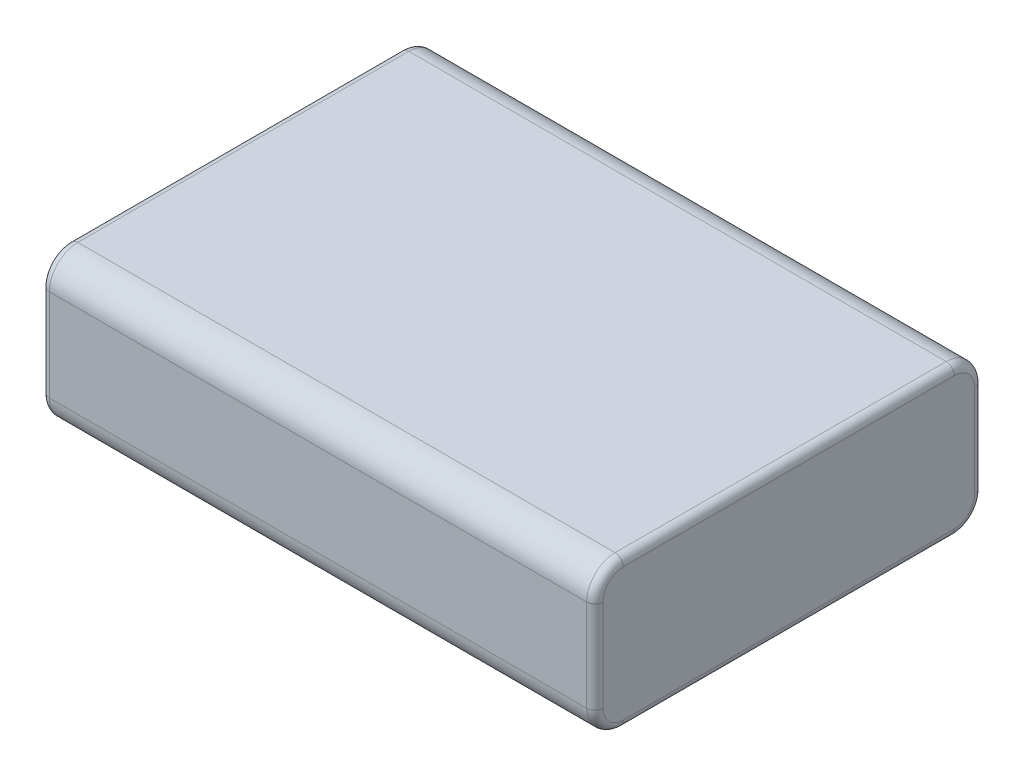
ISO-10303-21;
HEADER;
FILE_DESCRIPTION(('STEP AP214'),'2;1');
FILE_NAME('part.step','',(''),(''),'','','');
FILE_SCHEMA(('AUTOMOTIVE_DESIGN { 1 0 10303 214 1 1 1 1 }'));
ENDSEC;
DATA;
#1=APPLICATION_CONTEXT('core data for automotive mechanical design processes');
#2=APPLICATION_PROTOCOL_DEFINITION('international standard','automotive_design',2000,#1);
#3=PRODUCT_CONTEXT('',#1,'mechanical');
#4=PRODUCT('Part','Part','',(#3));
#5=PRODUCT_RELATED_PRODUCT_CATEGORY('part','',(#4));
#6=PRODUCT_DEFINITION_FORMATION('','',#4);
#7=PRODUCT_DEFINITION_CONTEXT('part definition',#1,'design');
#8=PRODUCT_DEFINITION('design','',#6,#7);
#9=PRODUCT_DEFINITION_SHAPE('','',#8);
#10=(LENGTH_UNIT() NAMED_UNIT(*) SI_UNIT(.MILLI.,.METRE.));
#11=(NAMED_UNIT(*) PLANE_ANGLE_UNIT() SI_UNIT($,.RADIAN.));
#12=(NAMED_UNIT(*) SI_UNIT($,.STERADIAN.) SOLID_ANGLE_UNIT());
#13=UNCERTAINTY_MEASURE_WITH_UNIT(LENGTH_MEASURE(1.E-05),#10,'distance_accuracy_value','');
#14=(GEOMETRIC_REPRESENTATION_CONTEXT(3) GLOBAL_UNCERTAINTY_ASSIGNED_CONTEXT((#13)) GLOBAL_UNIT_ASSIGNED_CONTEXT((#10,
#11,#12)) REPRESENTATION_CONTEXT('',''));
#15=CARTESIAN_POINT('',(0.,0.,0.));
#16=DIRECTION('',(0.,0.,1.));
#17=DIRECTION('',(1.,0.,0.));
#18=AXIS2_PLACEMENT_3D('',#15,#16,#17);
#19=CARTESIAN_POINT('',(34.,9.15,-23.825));
#20=DIRECTION('',(0.,0.,1.));
#21=DIRECTION('',(1.,0.,0.));
#22=AXIS2_PLACEMENT_3D('',#19,#20,#21);
#23=PLANE('',#22);
#24=DIRECTION('',(-1.,0.,0.));
#25=VECTOR('',#24,1.);
#26=CARTESIAN_POINT('',(34.,-5.65,-23.825));
#27=LINE('',#26,#25);
#28=CARTESIAN_POINT('',(33.,-5.65,-23.825));
#29=VERTEX_POINT('',#28);
#30=CARTESIAN_POINT('',(-33.,-5.65,-23.825));
#31=VERTEX_POINT('',#30);
#32=EDGE_CURVE('E302',#29,#31,#27,.T.);
#33=ORIENTED_EDGE('',*,*,#32,.T.);
#34=DIRECTION('',(0.,1.,0.));
#35=VECTOR('',#34,1.);
#36=CARTESIAN_POINT('',(-33.,9.15,-23.825));
#37=LINE('',#36,#35);
#38=CARTESIAN_POINT('',(-33.,5.65,-23.825));
#39=VERTEX_POINT('',#38);
#40=EDGE_CURVE('E201',#31,#39,#37,.T.);
#41=ORIENTED_EDGE('',*,*,#40,.T.);
#42=DIRECTION('',(-1.,0.,0.));
#43=VECTOR('',#42,1.);
#44=CARTESIAN_POINT('',(34.,5.65,-23.825));
#45=LINE('',#44,#43);
#46=CARTESIAN_POINT('',(33.,5.65,-23.825));
#47=VERTEX_POINT('',#46);
#48=EDGE_CURVE('E298',#39,#47,#45,.F.);
#49=ORIENTED_EDGE('',*,*,#48,.T.);
#50=DIRECTION('',(0.,1.,0.));
#51=VECTOR('',#50,1.);
#52=CARTESIAN_POINT('',(33.,-5.65,-23.825));
#53=LINE('',#52,#51);
#54=EDGE_CURVE('E199',#47,#29,#53,.F.);
#55=ORIENTED_EDGE('',*,*,#54,.T.);
#56=EDGE_LOOP('',(#33,#41,#49,#55));
#57=FACE_BOUND('',#56,.T.);
#58=ADVANCED_FACE('F36',(#57),#23,.F.);
#59=CARTESIAN_POINT('',(34.,9.15,23.825));
#60=DIRECTION('',(0.,-1.,0.));
#61=DIRECTION('',(0.,0.,-1.));
#62=AXIS2_PLACEMENT_3D('',#59,#60,#61);
#63=PLANE('',#62);
#64=DIRECTION('',(-1.,0.,0.));
#65=VECTOR('',#64,1.);
#66=CARTESIAN_POINT('',(34.,9.15,-20.325));
#67=LINE('',#66,#65);
#68=CARTESIAN_POINT('',(33.,9.15,-20.325));
#69=VERTEX_POINT('',#68);
#70=CARTESIAN_POINT('',(-33.,9.15,-20.325));
#71=VERTEX_POINT('',#70);
#72=EDGE_CURVE('E178',#69,#71,#67,.T.);
#73=ORIENTED_EDGE('',*,*,#72,.T.);
#74=DIRECTION('',(0.,0.,1.));
#75=VECTOR('',#74,1.);
#76=CARTESIAN_POINT('',(-33.,9.15,23.825));
#77=LINE('',#76,#75);
#78=CARTESIAN_POINT('',(-33.,9.15,20.325));
#79=VERTEX_POINT('',#78);
#80=EDGE_CURVE('E11',#71,#79,#77,.T.);
#81=ORIENTED_EDGE('',*,*,#80,.T.);
#82=DIRECTION('',(-1.,0.,0.));
#83=VECTOR('',#82,1.);
#84=CARTESIAN_POINT('',(34.,9.15,20.325));
#85=LINE('',#84,#83);
#86=CARTESIAN_POINT('',(33.,9.15,20.325));
#87=VERTEX_POINT('',#86);
#88=EDGE_CURVE('E175',#79,#87,#85,.F.);
#89=ORIENTED_EDGE('',*,*,#88,.T.);
#90=DIRECTION('',(0.,0.,1.));
#91=VECTOR('',#90,1.);
#92=CARTESIAN_POINT('',(33.,9.15,-20.325));
#93=LINE('',#92,#91);
#94=EDGE_CURVE('E45',#87,#69,#93,.F.);
#95=ORIENTED_EDGE('',*,*,#94,.T.);
#96=EDGE_LOOP('',(#73,#81,#89,#95));
#97=FACE_BOUND('',#96,.T.);
#98=ADVANCED_FACE('F311',(#97),#63,.F.);
#99=CARTESIAN_POINT('',(34.,9.15,23.825));
#100=DIRECTION('',(0.,0.,-1.));
#101=DIRECTION('',(0.,1.,0.));
#102=AXIS2_PLACEMENT_3D('',#99,#100,#101);
#103=PLANE('',#102);
#104=DIRECTION('',(-1.,0.,0.));
#105=VECTOR('',#104,1.);
#106=CARTESIAN_POINT('',(34.,5.65,23.825));
#107=LINE('',#106,#105);
#108=CARTESIAN_POINT('',(33.,5.65,23.825));
#109=VERTEX_POINT('',#108);
#110=CARTESIAN_POINT('',(-33.,5.65,23.825));
#111=VERTEX_POINT('',#110);
#112=EDGE_CURVE('E299',#109,#111,#107,.T.);
#113=ORIENTED_EDGE('',*,*,#112,.T.);
#114=DIRECTION('',(0.,-1.,0.));
#115=VECTOR('',#114,1.);
#116=CARTESIAN_POINT('',(-33.,9.15,23.825));
#117=LINE('',#116,#115);
#118=CARTESIAN_POINT('',(-33.,-5.65,23.825));
#119=VERTEX_POINT('',#118);
#120=EDGE_CURVE('E217',#111,#119,#117,.T.);
#121=ORIENTED_EDGE('',*,*,#120,.T.);
#122=DIRECTION('',(-1.,0.,0.));
#123=VECTOR('',#122,1.);
#124=CARTESIAN_POINT('',(34.,-5.65,23.825));
#125=LINE('',#124,#123);
#126=CARTESIAN_POINT('',(33.,-5.65,23.825));
#127=VERTEX_POINT('',#126);
#128=EDGE_CURVE('E289',#119,#127,#125,.F.);
#129=ORIENTED_EDGE('',*,*,#128,.T.);
#130=DIRECTION('',(0.,-1.,0.));
#131=VECTOR('',#130,1.);
#132=CARTESIAN_POINT('',(33.,5.65,23.825));
#133=LINE('',#132,#131);
#134=EDGE_CURVE('E215',#127,#109,#133,.F.);
#135=ORIENTED_EDGE('',*,*,#134,.T.);
#136=EDGE_LOOP('',(#113,#121,#129,#135));
#137=FACE_BOUND('',#136,.T.);
#138=ADVANCED_FACE('F295',(#137),#103,.F.);
#139=CARTESIAN_POINT('',(34.,-9.15,23.825));
#140=DIRECTION('',(0.,1.,0.));
#141=DIRECTION('',(0.,0.,1.));
#142=AXIS2_PLACEMENT_3D('',#139,#140,#141);
#143=PLANE('',#142);
#144=DIRECTION('',(-1.,0.,0.));
#145=VECTOR('',#144,1.);
#146=CARTESIAN_POINT('',(34.,-9.15,20.325));
#147=LINE('',#146,#145);
#148=CARTESIAN_POINT('',(33.,-9.15,20.325));
#149=VERTEX_POINT('',#148);
#150=CARTESIAN_POINT('',(-33.,-9.15,20.325));
#151=VERTEX_POINT('',#150);
#152=EDGE_CURVE('E292',#149,#151,#147,.T.);
#153=ORIENTED_EDGE('',*,*,#152,.T.);
#154=DIRECTION('',(0.,0.,-1.));
#155=VECTOR('',#154,1.);
#156=CARTESIAN_POINT('',(-33.,-9.15,23.825));
#157=LINE('',#156,#155);
#158=CARTESIAN_POINT('',(-33.,-9.15,-20.325));
#159=VERTEX_POINT('',#158);
#160=EDGE_CURVE('E209',#151,#159,#157,.T.);
#161=ORIENTED_EDGE('',*,*,#160,.T.);
#162=DIRECTION('',(-1.,0.,0.));
#163=VECTOR('',#162,1.);
#164=CARTESIAN_POINT('',(34.,-9.15,-20.325));
#165=LINE('',#164,#163);
#166=CARTESIAN_POINT('',(33.,-9.15,-20.325));
#167=VERTEX_POINT('',#166);
#168=EDGE_CURVE('E252',#159,#167,#165,.F.);
#169=ORIENTED_EDGE('',*,*,#168,.T.);
#170=DIRECTION('',(0.,0.,-1.));
#171=VECTOR('',#170,1.);
#172=CARTESIAN_POINT('',(33.,-9.15,20.325));
#173=LINE('',#172,#171);
#174=EDGE_CURVE('E207',#167,#149,#173,.F.);
#175=ORIENTED_EDGE('',*,*,#174,.T.);
#176=EDGE_LOOP('',(#153,#161,#169,#175));
#177=FACE_BOUND('',#176,.T.);
#178=ADVANCED_FACE('F331',(#177),#143,.F.);
#179=CARTESIAN_POINT('',(34.,0.,0.));
#180=DIRECTION('',(1.,0.,0.));
#181=DIRECTION('',(0.,0.,-1.));
#182=AXIS2_PLACEMENT_3D('',#179,#180,#181);
#183=PLANE('',#182);
#184=DIRECTION('',(0.,1.,0.));
#185=VECTOR('',#184,1.);
#186=CARTESIAN_POINT('',(34.,5.65,-22.825));
#187=LINE('',#186,#185);
#188=CARTESIAN_POINT('',(34.,-5.65,-22.825));
#189=VERTEX_POINT('',#188);
#190=CARTESIAN_POINT('',(34.,5.65,-22.825));
#191=VERTEX_POINT('',#190);
#192=EDGE_CURVE('E53',#189,#191,#187,.T.);
#193=ORIENTED_EDGE('',*,*,#192,.T.);
#194=CARTESIAN_POINT('',(34.,5.65,-20.325));
#195=DIRECTION('',(1.,0.,0.));
#196=DIRECTION('',(0.,0.,-1.));
#197=AXIS2_PLACEMENT_3D('',#194,#195,#196);
#198=CIRCLE('',#197,2.5);
#199=CARTESIAN_POINT('',(34.,8.15,-20.325));
#200=VERTEX_POINT('',#199);
#201=EDGE_CURVE('E234',#191,#200,#198,.T.);
#202=ORIENTED_EDGE('',*,*,#201,.T.);
#203=DIRECTION('',(0.,0.,1.));
#204=VECTOR('',#203,1.);
#205=CARTESIAN_POINT('',(34.,8.15,20.325));
#206=LINE('',#205,#204);
#207=CARTESIAN_POINT('',(34.,8.15,20.325));
#208=VERTEX_POINT('',#207);
#209=EDGE_CURVE('E222',#200,#208,#206,.T.);
#210=ORIENTED_EDGE('',*,*,#209,.T.);
#211=CARTESIAN_POINT('',(34.,5.65,20.325));
#212=DIRECTION('',(1.,0.,0.));
#213=DIRECTION('',(0.,0.,-1.));
#214=AXIS2_PLACEMENT_3D('',#211,#212,#213);
#215=CIRCLE('',#214,2.5);
#216=CARTESIAN_POINT('',(34.,5.65,22.825));
#217=VERTEX_POINT('',#216);
#218=EDGE_CURVE('E224',#208,#217,#215,.T.);
#219=ORIENTED_EDGE('',*,*,#218,.T.);
#220=DIRECTION('',(0.,-1.,0.));
#221=VECTOR('',#220,1.);
#222=CARTESIAN_POINT('',(34.,-5.65,22.825));
#223=LINE('',#222,#221);
#224=CARTESIAN_POINT('',(34.,-5.65,22.825));
#225=VERTEX_POINT('',#224);
#226=EDGE_CURVE('E226',#217,#225,#223,.T.);
#227=ORIENTED_EDGE('',*,*,#226,.T.);
#228=CARTESIAN_POINT('',(34.,-5.65,20.325));
#229=DIRECTION('',(1.,0.,0.));
#230=DIRECTION('',(0.,0.,-1.));
#231=AXIS2_PLACEMENT_3D('',#228,#229,#230);
#232=CIRCLE('',#231,2.5);
#233=CARTESIAN_POINT('',(34.,-8.15,20.325));
#234=VERTEX_POINT('',#233);
#235=EDGE_CURVE('E228',#225,#234,#232,.T.);
#236=ORIENTED_EDGE('',*,*,#235,.T.);
#237=DIRECTION('',(0.,0.,-1.));
#238=VECTOR('',#237,1.);
#239=CARTESIAN_POINT('',(34.,-8.15,-20.325));
#240=LINE('',#239,#238);
#241=CARTESIAN_POINT('',(34.,-8.15,-20.325));
#242=VERTEX_POINT('',#241);
#243=EDGE_CURVE('E230',#234,#242,#240,.T.);
#244=ORIENTED_EDGE('',*,*,#243,.T.);
#245=CARTESIAN_POINT('',(34.,-5.65,-20.325));
#246=DIRECTION('',(1.,0.,0.));
#247=DIRECTION('',(0.,0.,-1.));
#248=AXIS2_PLACEMENT_3D('',#245,#246,#247);
#249=CIRCLE('',#248,2.5);
#250=EDGE_CURVE('E58',#242,#189,#249,.T.);
#251=ORIENTED_EDGE('',*,*,#250,.T.);
#252=EDGE_LOOP('',(#193,#202,#210,#219,#227,#236,#244,#251));
#253=FACE_BOUND('',#252,.T.);
#254=ADVANCED_FACE('F329',(#253),#183,.T.);
#255=CARTESIAN_POINT('',(-34.,0.,0.));
#256=DIRECTION('',(1.,0.,0.));
#257=DIRECTION('',(0.,0.,-1.));
#258=AXIS2_PLACEMENT_3D('',#255,#256,#257);
#259=PLANE('',#258);
#260=DIRECTION('',(0.,0.,1.));
#261=VECTOR('',#260,1.);
#262=CARTESIAN_POINT('',(-34.,8.15,0.));
#263=LINE('',#262,#261);
#264=CARTESIAN_POINT('',(-34.,8.15,20.325));
#265=VERTEX_POINT('',#264);
#266=CARTESIAN_POINT('',(-34.,8.15,-20.325));
#267=VERTEX_POINT('',#266);
#268=EDGE_CURVE('E154',#265,#267,#263,.F.);
#269=ORIENTED_EDGE('',*,*,#268,.T.);
#270=CARTESIAN_POINT('',(-34.,5.65,-20.325));
#271=DIRECTION('',(1.,0.,0.));
#272=DIRECTION('',(0.,0.,-1.));
#273=AXIS2_PLACEMENT_3D('',#270,#271,#272);
#274=CIRCLE('',#273,2.5);
#275=CARTESIAN_POINT('',(-34.,5.65,-22.825));
#276=VERTEX_POINT('',#275);
#277=EDGE_CURVE('E191',#267,#276,#274,.F.);
#278=ORIENTED_EDGE('',*,*,#277,.T.);
#279=DIRECTION('',(0.,1.,0.));
#280=VECTOR('',#279,1.);
#281=CARTESIAN_POINT('',(-34.,0.,-22.825));
#282=LINE('',#281,#280);
#283=CARTESIAN_POINT('',(-34.,-5.65,-22.825));
#284=VERTEX_POINT('',#283);
#285=EDGE_CURVE('E189',#276,#284,#282,.F.);
#286=ORIENTED_EDGE('',*,*,#285,.T.);
#287=CARTESIAN_POINT('',(-34.,-5.65,-20.325));
#288=DIRECTION('',(1.,0.,0.));
#289=DIRECTION('',(0.,0.,-1.));
#290=AXIS2_PLACEMENT_3D('',#287,#288,#289);
#291=CIRCLE('',#290,2.5);
#292=CARTESIAN_POINT('',(-34.,-8.15,-20.325));
#293=VERTEX_POINT('',#292);
#294=EDGE_CURVE('E187',#284,#293,#291,.F.);
#295=ORIENTED_EDGE('',*,*,#294,.T.);
#296=DIRECTION('',(0.,0.,-1.));
#297=VECTOR('',#296,1.);
#298=CARTESIAN_POINT('',(-34.,-8.15,0.));
#299=LINE('',#298,#297);
#300=CARTESIAN_POINT('',(-34.,-8.15,20.325));
#301=VERTEX_POINT('',#300);
#302=EDGE_CURVE('E185',#293,#301,#299,.F.);
#303=ORIENTED_EDGE('',*,*,#302,.T.);
#304=CARTESIAN_POINT('',(-34.,-5.65,20.325));
#305=DIRECTION('',(1.,0.,0.));
#306=DIRECTION('',(0.,0.,-1.));
#307=AXIS2_PLACEMENT_3D('',#304,#305,#306);
#308=CIRCLE('',#307,2.5);
#309=CARTESIAN_POINT('',(-34.,-5.65,22.825));
#310=VERTEX_POINT('',#309);
#311=EDGE_CURVE('E183',#301,#310,#308,.F.);
#312=ORIENTED_EDGE('',*,*,#311,.T.);
#313=DIRECTION('',(0.,-1.,0.));
#314=VECTOR('',#313,1.);
#315=CARTESIAN_POINT('',(-34.,0.,22.825));
#316=LINE('',#315,#314);
#317=CARTESIAN_POINT('',(-34.,5.65,22.825));
#318=VERTEX_POINT('',#317);
#319=EDGE_CURVE('E157',#310,#318,#316,.F.);
#320=ORIENTED_EDGE('',*,*,#319,.T.);
#321=CARTESIAN_POINT('',(-34.,5.65,20.325));
#322=DIRECTION('',(1.,0.,0.));
#323=DIRECTION('',(0.,0.,-1.));
#324=AXIS2_PLACEMENT_3D('',#321,#322,#323);
#325=CIRCLE('',#324,2.5);
#326=EDGE_CURVE('E149',#318,#265,#325,.F.);
#327=ORIENTED_EDGE('',*,*,#326,.T.);
#328=EDGE_LOOP('',(#269,#278,#286,#295,#303,#312,#320,#327));
#329=FACE_BOUND('',#328,.T.);
#330=ADVANCED_FACE('F151',(#329),#259,.F.);
#331=CARTESIAN_POINT('',(34.,-5.65,20.325));
#332=DIRECTION('',(-1.,0.,0.));
#333=DIRECTION('',(0.,0.,1.));
#334=AXIS2_PLACEMENT_3D('',#331,#332,#333);
#335=CYLINDRICAL_SURFACE('',#334,3.5);
#336=ORIENTED_EDGE('',*,*,#128,.F.);
#337=CARTESIAN_POINT('',(-33.,-5.65,20.325));
#338=DIRECTION('',(1.,0.,0.));
#339=DIRECTION('',(0.,0.,-1.));
#340=AXIS2_PLACEMENT_3D('',#337,#338,#339);
#341=CIRCLE('',#340,3.5);
#342=EDGE_CURVE('E213',#119,#151,#341,.T.);
#343=ORIENTED_EDGE('',*,*,#342,.T.);
#344=ORIENTED_EDGE('',*,*,#152,.F.);
#345=CARTESIAN_POINT('',(33.,-5.65,20.325));
#346=DIRECTION('',(1.,0.,0.));
#347=DIRECTION('',(0.,0.,-1.));
#348=AXIS2_PLACEMENT_3D('',#345,#346,#347);
#349=CIRCLE('',#348,3.5);
#350=EDGE_CURVE('E211',#149,#127,#349,.F.);
#351=ORIENTED_EDGE('',*,*,#350,.T.);
#352=EDGE_LOOP('',(#336,#343,#344,#351));
#353=FACE_BOUND('',#352,.T.);
#354=ADVANCED_FACE('F288',(#353),#335,.T.);
#355=CARTESIAN_POINT('',(34.,-5.65,-20.325));
#356=DIRECTION('',(-1.,0.,0.));
#357=DIRECTION('',(0.,0.,1.));
#358=AXIS2_PLACEMENT_3D('',#355,#356,#357);
#359=CYLINDRICAL_SURFACE('',#358,3.5);
#360=ORIENTED_EDGE('',*,*,#168,.F.);
#361=CARTESIAN_POINT('',(-33.,-5.65,-20.325));
#362=DIRECTION('',(1.,0.,0.));
#363=DIRECTION('',(0.,0.,-1.));
#364=AXIS2_PLACEMENT_3D('',#361,#362,#363);
#365=CIRCLE('',#364,3.5);
#366=EDGE_CURVE('E205',#159,#31,#365,.T.);
#367=ORIENTED_EDGE('',*,*,#366,.T.);
#368=ORIENTED_EDGE('',*,*,#32,.F.);
#369=CARTESIAN_POINT('',(33.,-5.65,-20.325));
#370=DIRECTION('',(1.,0.,0.));
#371=DIRECTION('',(0.,0.,-1.));
#372=AXIS2_PLACEMENT_3D('',#369,#370,#371);
#373=CIRCLE('',#372,3.5);
#374=EDGE_CURVE('E203',#29,#167,#373,.F.);
#375=ORIENTED_EDGE('',*,*,#374,.T.);
#376=EDGE_LOOP('',(#360,#367,#368,#375));
#377=FACE_BOUND('',#376,.T.);
#378=ADVANCED_FACE('F351',(#377),#359,.T.);
#379=CARTESIAN_POINT('',(34.,5.65,20.325));
#380=DIRECTION('',(-1.,0.,0.));
#381=DIRECTION('',(0.,0.,1.));
#382=AXIS2_PLACEMENT_3D('',#379,#380,#381);
#383=CYLINDRICAL_SURFACE('',#382,3.5);
#384=ORIENTED_EDGE('',*,*,#88,.F.);
#385=CARTESIAN_POINT('',(-33.,5.65,20.325));
#386=DIRECTION('',(1.,0.,0.));
#387=DIRECTION('',(0.,0.,-1.));
#388=AXIS2_PLACEMENT_3D('',#385,#386,#387);
#389=CIRCLE('',#388,3.5);
#390=EDGE_CURVE('E166',#79,#111,#389,.T.);
#391=ORIENTED_EDGE('',*,*,#390,.T.);
#392=ORIENTED_EDGE('',*,*,#112,.F.);
#393=CARTESIAN_POINT('',(33.,5.65,20.325));
#394=DIRECTION('',(1.,0.,0.));
#395=DIRECTION('',(0.,0.,-1.));
#396=AXIS2_PLACEMENT_3D('',#393,#394,#395);
#397=CIRCLE('',#396,3.5);
#398=EDGE_CURVE('E219',#109,#87,#397,.F.);
#399=ORIENTED_EDGE('',*,*,#398,.T.);
#400=EDGE_LOOP('',(#384,#391,#392,#399));
#401=FACE_BOUND('',#400,.T.);
#402=ADVANCED_FACE('F354',(#401),#383,.T.);
#403=CARTESIAN_POINT('',(34.,5.65,-20.325));
#404=DIRECTION('',(-1.,0.,0.));
#405=DIRECTION('',(0.,0.,1.));
#406=AXIS2_PLACEMENT_3D('',#403,#404,#405);
#407=CYLINDRICAL_SURFACE('',#406,3.5);
#408=ORIENTED_EDGE('',*,*,#48,.F.);
#409=CARTESIAN_POINT('',(-33.,5.65,-20.325));
#410=DIRECTION('',(1.,0.,0.));
#411=DIRECTION('',(0.,0.,-1.));
#412=AXIS2_PLACEMENT_3D('',#409,#410,#411);
#413=CIRCLE('',#412,3.5);
#414=EDGE_CURVE('E196',#39,#71,#413,.T.);
#415=ORIENTED_EDGE('',*,*,#414,.T.);
#416=ORIENTED_EDGE('',*,*,#72,.F.);
#417=CARTESIAN_POINT('',(33.,5.65,-20.325));
#418=DIRECTION('',(1.,0.,0.));
#419=DIRECTION('',(0.,0.,-1.));
#420=AXIS2_PLACEMENT_3D('',#417,#418,#419);
#421=CIRCLE('',#420,3.5);
#422=EDGE_CURVE('E193',#69,#47,#421,.F.);
#423=ORIENTED_EDGE('',*,*,#422,.T.);
#424=EDGE_LOOP('',(#408,#415,#416,#423));
#425=FACE_BOUND('',#424,.T.);
#426=ADVANCED_FACE('F317',(#425),#407,.T.);
#427=CARTESIAN_POINT('',(-33.,-5.65,20.325));
#428=DIRECTION('',(1.,0.,0.));
#429=DIRECTION('',(0.,0.,-1.));
#430=AXIS2_PLACEMENT_3D('',#427,#428,#429);
#431=TOROIDAL_SURFACE('',#430,2.5,1.);
#432=CARTESIAN_POINT('',(-33.,-8.15,20.325));
#433=DIRECTION('',(0.,0.,-1.));
#434=DIRECTION('',(-1.,0.,0.));
#435=AXIS2_PLACEMENT_3D('',#432,#433,#434);
#436=CIRCLE('',#435,1.);
#437=EDGE_CURVE('E246',#151,#301,#436,.T.);
#438=ORIENTED_EDGE('',*,*,#437,.F.);
#439=ORIENTED_EDGE('',*,*,#342,.F.);
#440=CARTESIAN_POINT('',(-33.,-5.65,22.825));
#441=DIRECTION('',(0.,1.,0.));
#442=DIRECTION('',(0.,0.,1.));
#443=AXIS2_PLACEMENT_3D('',#440,#441,#442);
#444=CIRCLE('',#443,1.);
#445=EDGE_CURVE('E249',#310,#119,#444,.T.);
#446=ORIENTED_EDGE('',*,*,#445,.F.);
#447=ORIENTED_EDGE('',*,*,#311,.F.);
#448=EDGE_LOOP('',(#438,#439,#446,#447));
#449=FACE_BOUND('',#448,.T.);
#450=ADVANCED_FACE('F361',(#449),#431,.T.);
#451=CARTESIAN_POINT('',(-33.,9.15,22.825));
#452=DIRECTION('',(0.,-1.,0.));
#453=DIRECTION('',(0.,0.,-1.));
#454=AXIS2_PLACEMENT_3D('',#451,#452,#453);
#455=CYLINDRICAL_SURFACE('',#454,1.);
#456=ORIENTED_EDGE('',*,*,#445,.T.);
#457=ORIENTED_EDGE('',*,*,#120,.F.);
#458=CARTESIAN_POINT('',(-33.,5.65,22.825));
#459=DIRECTION('',(0.,1.,0.));
#460=DIRECTION('',(0.,0.,1.));
#461=AXIS2_PLACEMENT_3D('',#458,#459,#460);
#462=CIRCLE('',#461,1.);
#463=EDGE_CURVE('E244',#318,#111,#462,.T.);
#464=ORIENTED_EDGE('',*,*,#463,.F.);
#465=ORIENTED_EDGE('',*,*,#319,.F.);
#466=EDGE_LOOP('',(#456,#457,#464,#465));
#467=FACE_BOUND('',#466,.T.);
#468=ADVANCED_FACE('F381',(#467),#455,.T.);
#469=CARTESIAN_POINT('',(-33.,-8.15,23.825));
#470=DIRECTION('',(0.,0.,-1.));
#471=DIRECTION('',(-1.,0.,0.));
#472=AXIS2_PLACEMENT_3D('',#469,#470,#471);
#473=CYLINDRICAL_SURFACE('',#472,1.);
#474=ORIENTED_EDGE('',*,*,#437,.T.);
#475=ORIENTED_EDGE('',*,*,#302,.F.);
#476=CARTESIAN_POINT('',(-33.,-8.15,-20.325));
#477=DIRECTION('',(0.,0.,-1.));
#478=DIRECTION('',(-1.,0.,0.));
#479=AXIS2_PLACEMENT_3D('',#476,#477,#478);
#480=CIRCLE('',#479,1.);
#481=EDGE_CURVE('E169',#159,#293,#480,.T.);
#482=ORIENTED_EDGE('',*,*,#481,.F.);
#483=ORIENTED_EDGE('',*,*,#160,.F.);
#484=EDGE_LOOP('',(#474,#475,#482,#483));
#485=FACE_BOUND('',#484,.T.);
#486=ADVANCED_FACE('F378',(#485),#473,.T.);
#487=CARTESIAN_POINT('',(-33.,5.65,20.325));
#488=DIRECTION('',(1.,0.,0.));
#489=DIRECTION('',(0.,0.,-1.));
#490=AXIS2_PLACEMENT_3D('',#487,#488,#489);
#491=TOROIDAL_SURFACE('',#490,2.5,1.);
#492=ORIENTED_EDGE('',*,*,#463,.T.);
#493=ORIENTED_EDGE('',*,*,#390,.F.);
#494=CARTESIAN_POINT('',(-33.,8.15,20.325));
#495=DIRECTION('',(0.,0.,-1.));
#496=DIRECTION('',(-1.,0.,0.));
#497=AXIS2_PLACEMENT_3D('',#494,#495,#496);
#498=CIRCLE('',#497,1.);
#499=EDGE_CURVE('E164',#265,#79,#498,.T.);
#500=ORIENTED_EDGE('',*,*,#499,.F.);
#501=ORIENTED_EDGE('',*,*,#326,.F.);
#502=EDGE_LOOP('',(#492,#493,#500,#501));
#503=FACE_BOUND('',#502,.T.);
#504=ADVANCED_FACE('F165',(#503),#491,.T.);
#505=CARTESIAN_POINT('',(-33.,-5.65,-20.325));
#506=DIRECTION('',(1.,0.,0.));
#507=DIRECTION('',(0.,0.,-1.));
#508=AXIS2_PLACEMENT_3D('',#505,#506,#507);
#509=TOROIDAL_SURFACE('',#508,2.5,1.);
#510=ORIENTED_EDGE('',*,*,#481,.T.);
#511=ORIENTED_EDGE('',*,*,#294,.F.);
#512=CARTESIAN_POINT('',(-33.,-5.65,-22.825));
#513=DIRECTION('',(0.,1.,0.));
#514=DIRECTION('',(0.,0.,1.));
#515=AXIS2_PLACEMENT_3D('',#512,#513,#514);
#516=CIRCLE('',#515,1.);
#517=EDGE_CURVE('E170',#31,#284,#516,.T.);
#518=ORIENTED_EDGE('',*,*,#517,.F.);
#519=ORIENTED_EDGE('',*,*,#366,.F.);
#520=EDGE_LOOP('',(#510,#511,#518,#519));
#521=FACE_BOUND('',#520,.T.);
#522=ADVANCED_FACE('F372',(#521),#509,.T.);
#523=CARTESIAN_POINT('',(-33.,8.15,23.825));
#524=DIRECTION('',(0.,0.,1.));
#525=DIRECTION('',(1.,0.,0.));
#526=AXIS2_PLACEMENT_3D('',#523,#524,#525);
#527=CYLINDRICAL_SURFACE('',#526,1.);
#528=ORIENTED_EDGE('',*,*,#499,.T.);
#529=ORIENTED_EDGE('',*,*,#80,.F.);
#530=CARTESIAN_POINT('',(-33.,8.15,-20.325));
#531=DIRECTION('',(0.,0.,-1.));
#532=DIRECTION('',(-1.,0.,0.));
#533=AXIS2_PLACEMENT_3D('',#530,#531,#532);
#534=CIRCLE('',#533,1.);
#535=EDGE_CURVE('E173',#267,#71,#534,.T.);
#536=ORIENTED_EDGE('',*,*,#535,.F.);
#537=ORIENTED_EDGE('',*,*,#268,.F.);
#538=EDGE_LOOP('',(#528,#529,#536,#537));
#539=FACE_BOUND('',#538,.T.);
#540=ADVANCED_FACE('F172',(#539),#527,.T.);
#541=CARTESIAN_POINT('',(-33.,9.15,-22.825));
#542=DIRECTION('',(0.,1.,0.));
#543=DIRECTION('',(0.,0.,1.));
#544=AXIS2_PLACEMENT_3D('',#541,#542,#543);
#545=CYLINDRICAL_SURFACE('',#544,1.);
#546=ORIENTED_EDGE('',*,*,#517,.T.);
#547=ORIENTED_EDGE('',*,*,#285,.F.);
#548=CARTESIAN_POINT('',(-33.,5.65,-22.825));
#549=DIRECTION('',(0.,1.,0.));
#550=DIRECTION('',(0.,0.,1.));
#551=AXIS2_PLACEMENT_3D('',#548,#549,#550);
#552=CIRCLE('',#551,1.);
#553=EDGE_CURVE('E237',#39,#276,#552,.T.);
#554=ORIENTED_EDGE('',*,*,#553,.F.);
#555=ORIENTED_EDGE('',*,*,#40,.F.);
#556=EDGE_LOOP('',(#546,#547,#554,#555));
#557=FACE_BOUND('',#556,.T.);
#558=ADVANCED_FACE('F365',(#557),#545,.T.);
#559=CARTESIAN_POINT('',(-33.,5.65,-20.325));
#560=DIRECTION('',(1.,0.,0.));
#561=DIRECTION('',(0.,0.,-1.));
#562=AXIS2_PLACEMENT_3D('',#559,#560,#561);
#563=TOROIDAL_SURFACE('',#562,2.5,1.);
#564=ORIENTED_EDGE('',*,*,#535,.T.);
#565=ORIENTED_EDGE('',*,*,#414,.F.);
#566=ORIENTED_EDGE('',*,*,#553,.T.);
#567=ORIENTED_EDGE('',*,*,#277,.F.);
#568=EDGE_LOOP('',(#564,#565,#566,#567));
#569=FACE_BOUND('',#568,.T.);
#570=ADVANCED_FACE('F362',(#569),#563,.T.);
#571=CARTESIAN_POINT('',(33.,-5.65,20.325));
#572=DIRECTION('',(1.,0.,0.));
#573=DIRECTION('',(0.,0.,-1.));
#574=AXIS2_PLACEMENT_3D('',#571,#572,#573);
#575=TOROIDAL_SURFACE('',#574,2.5,1.);
#576=CARTESIAN_POINT('',(33.,-5.65,22.825));
#577=DIRECTION('',(0.,1.,0.));
#578=DIRECTION('',(0.,0.,1.));
#579=AXIS2_PLACEMENT_3D('',#576,#577,#578);
#580=CIRCLE('',#579,1.);
#581=EDGE_CURVE('E268',#127,#225,#580,.T.);
#582=ORIENTED_EDGE('',*,*,#581,.F.);
#583=ORIENTED_EDGE('',*,*,#350,.F.);
#584=CARTESIAN_POINT('',(33.,-8.15,20.325));
#585=DIRECTION('',(0.,0.,-1.));
#586=DIRECTION('',(-1.,0.,0.));
#587=AXIS2_PLACEMENT_3D('',#584,#585,#586);
#588=CIRCLE('',#587,1.);
#589=EDGE_CURVE('E40',#234,#149,#588,.T.);
#590=ORIENTED_EDGE('',*,*,#589,.F.);
#591=ORIENTED_EDGE('',*,*,#235,.F.);
#592=EDGE_LOOP('',(#582,#583,#590,#591));
#593=FACE_BOUND('',#592,.T.);
#594=ADVANCED_FACE('F38',(#593),#575,.T.);
#595=CARTESIAN_POINT('',(33.,-8.15,0.));
#596=DIRECTION('',(0.,0.,1.));
#597=DIRECTION('',(1.,0.,0.));
#598=AXIS2_PLACEMENT_3D('',#595,#596,#597);
#599=CYLINDRICAL_SURFACE('',#598,1.);
#600=ORIENTED_EDGE('',*,*,#589,.T.);
#601=ORIENTED_EDGE('',*,*,#174,.F.);
#602=CARTESIAN_POINT('',(33.,-8.15,-20.325));
#603=DIRECTION('',(0.,0.,-1.));
#604=DIRECTION('',(-1.,0.,0.));
#605=AXIS2_PLACEMENT_3D('',#602,#603,#604);
#606=CIRCLE('',#605,1.);
#607=EDGE_CURVE('E266',#242,#167,#606,.T.);
#608=ORIENTED_EDGE('',*,*,#607,.F.);
#609=ORIENTED_EDGE('',*,*,#243,.F.);
#610=EDGE_LOOP('',(#600,#601,#608,#609));
#611=FACE_BOUND('',#610,.T.);
#612=ADVANCED_FACE('F279',(#611),#599,.T.);
#613=CARTESIAN_POINT('',(33.,0.,22.825));
#614=DIRECTION('',(0.,1.,0.));
#615=DIRECTION('',(0.,0.,1.));
#616=AXIS2_PLACEMENT_3D('',#613,#614,#615);
#617=CYLINDRICAL_SURFACE('',#616,1.);
#618=ORIENTED_EDGE('',*,*,#581,.T.);
#619=ORIENTED_EDGE('',*,*,#226,.F.);
#620=CARTESIAN_POINT('',(33.,5.65,22.825));
#621=DIRECTION('',(0.,1.,0.));
#622=DIRECTION('',(0.,0.,1.));
#623=AXIS2_PLACEMENT_3D('',#620,#621,#622);
#624=CIRCLE('',#623,1.);
#625=EDGE_CURVE('E263',#109,#217,#624,.T.);
#626=ORIENTED_EDGE('',*,*,#625,.F.);
#627=ORIENTED_EDGE('',*,*,#134,.F.);
#628=EDGE_LOOP('',(#618,#619,#626,#627));
#629=FACE_BOUND('',#628,.T.);
#630=ADVANCED_FACE('F404',(#629),#617,.T.);
#631=CARTESIAN_POINT('',(33.,-5.65,-20.325));
#632=DIRECTION('',(1.,0.,0.));
#633=DIRECTION('',(0.,0.,-1.));
#634=AXIS2_PLACEMENT_3D('',#631,#632,#633);
#635=TOROIDAL_SURFACE('',#634,2.5,1.);
#636=ORIENTED_EDGE('',*,*,#607,.T.);
#637=ORIENTED_EDGE('',*,*,#374,.F.);
#638=CARTESIAN_POINT('',(33.,-5.65,-22.825));
#639=DIRECTION('',(0.,1.,0.));
#640=DIRECTION('',(0.,0.,1.));
#641=AXIS2_PLACEMENT_3D('',#638,#639,#640);
#642=CIRCLE('',#641,1.);
#643=EDGE_CURVE('E260',#189,#29,#642,.T.);
#644=ORIENTED_EDGE('',*,*,#643,.F.);
#645=ORIENTED_EDGE('',*,*,#250,.F.);
#646=EDGE_LOOP('',(#636,#637,#644,#645));
#647=FACE_BOUND('',#646,.T.);
#648=ADVANCED_FACE('F400',(#647),#635,.T.);
#649=CARTESIAN_POINT('',(33.,5.65,20.325));
#650=DIRECTION('',(1.,0.,0.));
#651=DIRECTION('',(0.,0.,-1.));
#652=AXIS2_PLACEMENT_3D('',#649,#650,#651);
#653=TOROIDAL_SURFACE('',#652,2.5,1.);
#654=ORIENTED_EDGE('',*,*,#625,.T.);
#655=ORIENTED_EDGE('',*,*,#218,.F.);
#656=CARTESIAN_POINT('',(33.,8.15,20.325));
#657=DIRECTION('',(0.,0.,-1.));
#658=DIRECTION('',(-1.,0.,0.));
#659=AXIS2_PLACEMENT_3D('',#656,#657,#658);
#660=CIRCLE('',#659,1.);
#661=EDGE_CURVE('E257',#87,#208,#660,.T.);
#662=ORIENTED_EDGE('',*,*,#661,.F.);
#663=ORIENTED_EDGE('',*,*,#398,.F.);
#664=EDGE_LOOP('',(#654,#655,#662,#663));
#665=FACE_BOUND('',#664,.T.);
#666=ADVANCED_FACE('F396',(#665),#653,.T.);
#667=CARTESIAN_POINT('',(33.,0.,-22.825));
#668=DIRECTION('',(0.,-1.,0.));
#669=DIRECTION('',(0.,0.,-1.));
#670=AXIS2_PLACEMENT_3D('',#667,#668,#669);
#671=CYLINDRICAL_SURFACE('',#670,1.);
#672=ORIENTED_EDGE('',*,*,#643,.T.);
#673=ORIENTED_EDGE('',*,*,#54,.F.);
#674=CARTESIAN_POINT('',(33.,5.65,-22.825));
#675=DIRECTION('',(0.,1.,0.));
#676=DIRECTION('',(0.,0.,1.));
#677=AXIS2_PLACEMENT_3D('',#674,#675,#676);
#678=CIRCLE('',#677,1.);
#679=EDGE_CURVE('E255',#191,#47,#678,.T.);
#680=ORIENTED_EDGE('',*,*,#679,.F.);
#681=ORIENTED_EDGE('',*,*,#192,.F.);
#682=EDGE_LOOP('',(#672,#673,#680,#681));
#683=FACE_BOUND('',#682,.T.);
#684=ADVANCED_FACE('F393',(#683),#671,.T.);
#685=CARTESIAN_POINT('',(33.,8.15,0.));
#686=DIRECTION('',(0.,0.,-1.));
#687=DIRECTION('',(-1.,0.,0.));
#688=AXIS2_PLACEMENT_3D('',#685,#686,#687);
#689=CYLINDRICAL_SURFACE('',#688,1.);
#690=ORIENTED_EDGE('',*,*,#661,.T.);
#691=ORIENTED_EDGE('',*,*,#209,.F.);
#692=CARTESIAN_POINT('',(33.,8.15,-20.325));
#693=DIRECTION('',(0.,0.,-1.));
#694=DIRECTION('',(-1.,0.,0.));
#695=AXIS2_PLACEMENT_3D('',#692,#693,#694);
#696=CIRCLE('',#695,1.);
#697=EDGE_CURVE('E253',#69,#200,#696,.T.);
#698=ORIENTED_EDGE('',*,*,#697,.F.);
#699=ORIENTED_EDGE('',*,*,#94,.F.);
#700=EDGE_LOOP('',(#690,#691,#698,#699));
#701=FACE_BOUND('',#700,.T.);
#702=ADVANCED_FACE('F326',(#701),#689,.T.);
#703=CARTESIAN_POINT('',(33.,5.65,-20.325));
#704=DIRECTION('',(1.,0.,0.));
#705=DIRECTION('',(0.,0.,-1.));
#706=AXIS2_PLACEMENT_3D('',#703,#704,#705);
#707=TOROIDAL_SURFACE('',#706,2.5,1.);
#708=ORIENTED_EDGE('',*,*,#679,.T.);
#709=ORIENTED_EDGE('',*,*,#422,.F.);
#710=ORIENTED_EDGE('',*,*,#697,.T.);
#711=ORIENTED_EDGE('',*,*,#201,.F.);
#712=EDGE_LOOP('',(#708,#709,#710,#711));
#713=FACE_BOUND('',#712,.T.);
#714=ADVANCED_FACE('F321',(#713),#707,.T.);
#715=CLOSED_SHELL('',(#58,#98,#138,#178,#254,#330,#354,#378,#402,#426,#450,#468,#486,#504,#522,
#540,#558,#570,#594,#612,#630,#648,#666,#684,#702,#714));
#716=MANIFOLD_SOLID_BREP('B2',#715);
#717=ADVANCED_BREP_SHAPE_REPRESENTATION('',(#18,#716),#14);
#718=SHAPE_DEFINITION_REPRESENTATION(#9,#717);
ENDSEC;
END-ISO-10303-21;
